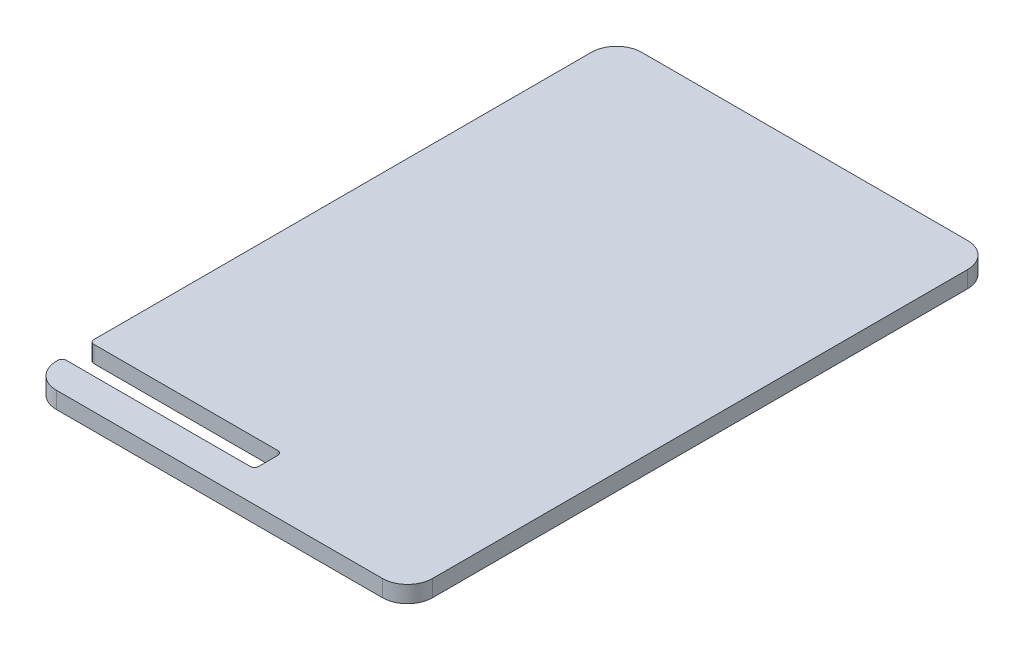
ISO-10303-21;
HEADER;
FILE_DESCRIPTION(('STEP AP214'),'2;1');
FILE_NAME('part.step','',(''),(''),'','','');
FILE_SCHEMA(('AUTOMOTIVE_DESIGN { 1 0 10303 214 1 1 1 1 }'));
ENDSEC;
DATA;
#1=APPLICATION_CONTEXT('core data for automotive mechanical design processes');
#2=APPLICATION_PROTOCOL_DEFINITION('international standard','automotive_design',2000,#1);
#3=PRODUCT_CONTEXT('',#1,'mechanical');
#4=PRODUCT('Part','Part','',(#3));
#5=PRODUCT_RELATED_PRODUCT_CATEGORY('part','',(#4));
#6=PRODUCT_DEFINITION_FORMATION('','',#4);
#7=PRODUCT_DEFINITION_CONTEXT('part definition',#1,'design');
#8=PRODUCT_DEFINITION('design','',#6,#7);
#9=PRODUCT_DEFINITION_SHAPE('','',#8);
#10=(LENGTH_UNIT() NAMED_UNIT(*) SI_UNIT(.MILLI.,.METRE.));
#11=(NAMED_UNIT(*) PLANE_ANGLE_UNIT() SI_UNIT($,.RADIAN.));
#12=(NAMED_UNIT(*) SI_UNIT($,.STERADIAN.) SOLID_ANGLE_UNIT());
#13=UNCERTAINTY_MEASURE_WITH_UNIT(LENGTH_MEASURE(1.E-05),#10,'distance_accuracy_value','');
#14=(GEOMETRIC_REPRESENTATION_CONTEXT(3) GLOBAL_UNCERTAINTY_ASSIGNED_CONTEXT((#13)) GLOBAL_UNIT_ASSIGNED_CONTEXT((#10,
#11,#12)) REPRESENTATION_CONTEXT('',''));
#15=CARTESIAN_POINT('',(0.,0.,0.));
#16=DIRECTION('',(0.,0.,1.));
#17=DIRECTION('',(1.,0.,0.));
#18=AXIS2_PLACEMENT_3D('',#15,#16,#17);
#19=CARTESIAN_POINT('',(-22.5,2.,-35.3062315740794));
#20=DIRECTION('',(1.,0.,0.));
#21=DIRECTION('',(0.,0.,-1.));
#22=AXIS2_PLACEMENT_3D('',#19,#20,#21);
#23=PLANE('',#22);
#24=DIRECTION('',(0.,0.,1.));
#25=VECTOR('',#24,1.);
#26=CARTESIAN_POINT('',(-22.5,0.,-35.3062315740794));
#27=LINE('',#26,#25);
#28=CARTESIAN_POINT('',(-22.5,0.,-32.3062315740794));
#29=VERTEX_POINT('',#28);
#30=CARTESIAN_POINT('',(-22.5,0.,27.2));
#31=VERTEX_POINT('',#30);
#32=EDGE_CURVE('E176',#29,#31,#27,.T.);
#33=ORIENTED_EDGE('',*,*,#32,.T.);
#34=DIRECTION('',(0.,1.,0.));
#35=VECTOR('',#34,1.);
#36=CARTESIAN_POINT('',(-22.5,2.,27.2));
#37=LINE('',#36,#35);
#38=CARTESIAN_POINT('',(-22.5,2.,27.2));
#39=VERTEX_POINT('',#38);
#40=EDGE_CURVE('E240',#31,#39,#37,.T.);
#41=ORIENTED_EDGE('',*,*,#40,.T.);
#42=DIRECTION('',(0.,0.,1.));
#43=VECTOR('',#42,1.);
#44=CARTESIAN_POINT('',(-22.5,2.,-35.3062315740794));
#45=LINE('',#44,#43);
#46=CARTESIAN_POINT('',(-22.5,2.,-32.3062315740794));
#47=VERTEX_POINT('',#46);
#48=EDGE_CURVE('E279',#47,#39,#45,.T.);
#49=ORIENTED_EDGE('',*,*,#48,.F.);
#50=DIRECTION('',(0.,-1.,0.));
#51=VECTOR('',#50,1.);
#52=CARTESIAN_POINT('',(-22.5,2.,-32.3062315740794));
#53=LINE('',#52,#51);
#54=EDGE_CURVE('E208',#47,#29,#53,.T.);
#55=ORIENTED_EDGE('',*,*,#54,.T.);
#56=EDGE_LOOP('',(#33,#41,#49,#55));
#57=FACE_BOUND('',#56,.T.);
#58=ADVANCED_FACE('F37',(#57),#23,.F.);
#59=CARTESIAN_POINT('',(-22.5,2.,31.5));
#60=VERTEX_POINT('',#59);
#61=CARTESIAN_POINT('',(-22.5,2.,31.6937684259206));
#62=VERTEX_POINT('',#61);
#63=EDGE_CURVE('E187',#60,#62,#45,.T.);
#64=ORIENTED_EDGE('',*,*,#63,.F.);
#65=DIRECTION('',(0.,1.,0.));
#66=VECTOR('',#65,1.);
#67=CARTESIAN_POINT('',(-22.5,2.,31.5));
#68=LINE('',#67,#66);
#69=CARTESIAN_POINT('',(-22.5,0.,31.5));
#70=VERTEX_POINT('',#69);
#71=EDGE_CURVE('E225',#60,#70,#68,.F.);
#72=ORIENTED_EDGE('',*,*,#71,.T.);
#73=CARTESIAN_POINT('',(-22.5,0.,31.6937684259206));
#74=VERTEX_POINT('',#73);
#75=EDGE_CURVE('E181',#70,#74,#27,.T.);
#76=ORIENTED_EDGE('',*,*,#75,.T.);
#77=DIRECTION('',(0.,-1.,0.));
#78=VECTOR('',#77,1.);
#79=CARTESIAN_POINT('',(-22.5,2.,31.6937684259206));
#80=LINE('',#79,#78);
#81=EDGE_CURVE('E157',#74,#62,#80,.F.);
#82=ORIENTED_EDGE('',*,*,#81,.T.);
#83=EDGE_LOOP('',(#64,#72,#76,#82));
#84=FACE_BOUND('',#83,.T.);
#85=ADVANCED_FACE('F313',(#84),#23,.F.);
#86=CARTESIAN_POINT('',(-22.5,2.,34.6937684259206));
#87=DIRECTION('',(0.,0.,-1.));
#88=DIRECTION('',(-1.,0.,0.));
#89=AXIS2_PLACEMENT_3D('',#86,#87,#88);
#90=PLANE('',#89);
#91=DIRECTION('',(1.,0.,0.));
#92=VECTOR('',#91,1.);
#93=CARTESIAN_POINT('',(-22.5,2.,34.6937684259206));
#94=LINE('',#93,#92);
#95=CARTESIAN_POINT('',(-19.5,2.,34.6937684259206));
#96=VERTEX_POINT('',#95);
#97=CARTESIAN_POINT('',(19.5,2.,34.6937684259206));
#98=VERTEX_POINT('',#97);
#99=EDGE_CURVE('E169',#96,#98,#94,.T.);
#100=ORIENTED_EDGE('',*,*,#99,.F.);
#101=DIRECTION('',(0.,-1.,0.));
#102=VECTOR('',#101,1.);
#103=CARTESIAN_POINT('',(-19.5,2.,34.6937684259206));
#104=LINE('',#103,#102);
#105=CARTESIAN_POINT('',(-19.5,0.,34.6937684259206));
#106=VERTEX_POINT('',#105);
#107=EDGE_CURVE('E155',#96,#106,#104,.T.);
#108=ORIENTED_EDGE('',*,*,#107,.T.);
#109=DIRECTION('',(1.,0.,0.));
#110=VECTOR('',#109,1.);
#111=CARTESIAN_POINT('',(-22.5,0.,34.6937684259206));
#112=LINE('',#111,#110);
#113=CARTESIAN_POINT('',(19.5,0.,34.6937684259206));
#114=VERTEX_POINT('',#113);
#115=EDGE_CURVE('E166',#106,#114,#112,.T.);
#116=ORIENTED_EDGE('',*,*,#115,.T.);
#117=DIRECTION('',(0.,-1.,0.));
#118=VECTOR('',#117,1.);
#119=CARTESIAN_POINT('',(19.5,2.,34.6937684259206));
#120=LINE('',#119,#118);
#121=EDGE_CURVE('E171',#114,#98,#120,.F.);
#122=ORIENTED_EDGE('',*,*,#121,.T.);
#123=EDGE_LOOP('',(#100,#108,#116,#122));
#124=FACE_BOUND('',#123,.T.);
#125=ADVANCED_FACE('F165',(#124),#90,.F.);
#126=CARTESIAN_POINT('',(22.5,2.,-35.3062315740794));
#127=DIRECTION('',(-1.,0.,0.));
#128=DIRECTION('',(0.,0.,1.));
#129=AXIS2_PLACEMENT_3D('',#126,#127,#128);
#130=PLANE('',#129);
#131=DIRECTION('',(0.,0.,-1.));
#132=VECTOR('',#131,1.);
#133=CARTESIAN_POINT('',(22.5,2.,-35.3062315740794));
#134=LINE('',#133,#132);
#135=CARTESIAN_POINT('',(22.5,2.,31.6937684259206));
#136=VERTEX_POINT('',#135);
#137=CARTESIAN_POINT('',(22.5,2.,-32.3062315740794));
#138=VERTEX_POINT('',#137);
#139=EDGE_CURVE('E283',#136,#138,#134,.T.);
#140=ORIENTED_EDGE('',*,*,#139,.F.);
#141=DIRECTION('',(0.,-1.,0.));
#142=VECTOR('',#141,1.);
#143=CARTESIAN_POINT('',(22.5,2.,31.6937684259206));
#144=LINE('',#143,#142);
#145=CARTESIAN_POINT('',(22.5,0.,31.6937684259206));
#146=VERTEX_POINT('',#145);
#147=EDGE_CURVE('E205',#136,#146,#144,.T.);
#148=ORIENTED_EDGE('',*,*,#147,.T.);
#149=DIRECTION('',(0.,0.,-1.));
#150=VECTOR('',#149,1.);
#151=CARTESIAN_POINT('',(22.5,0.,-35.3062315740794));
#152=LINE('',#151,#150);
#153=CARTESIAN_POINT('',(22.5,0.,-32.3062315740794));
#154=VERTEX_POINT('',#153);
#155=EDGE_CURVE('E175',#146,#154,#152,.T.);
#156=ORIENTED_EDGE('',*,*,#155,.T.);
#157=DIRECTION('',(0.,-1.,0.));
#158=VECTOR('',#157,1.);
#159=CARTESIAN_POINT('',(22.5,2.,-32.3062315740794));
#160=LINE('',#159,#158);
#161=EDGE_CURVE('E203',#154,#138,#160,.F.);
#162=ORIENTED_EDGE('',*,*,#161,.T.);
#163=EDGE_LOOP('',(#140,#148,#156,#162));
#164=FACE_BOUND('',#163,.T.);
#165=ADVANCED_FACE('F305',(#164),#130,.F.);
#166=CARTESIAN_POINT('',(-22.5,2.,-35.3062315740794));
#167=DIRECTION('',(0.,0.,1.));
#168=DIRECTION('',(1.,0.,0.));
#169=AXIS2_PLACEMENT_3D('',#166,#167,#168);
#170=PLANE('',#169);
#171=DIRECTION('',(-1.,0.,0.));
#172=VECTOR('',#171,1.);
#173=CARTESIAN_POINT('',(-22.5,0.,-35.3062315740794));
#174=LINE('',#173,#172);
#175=CARTESIAN_POINT('',(19.5,0.,-35.3062315740794));
#176=VERTEX_POINT('',#175);
#177=CARTESIAN_POINT('',(-19.5,0.,-35.3062315740794));
#178=VERTEX_POINT('',#177);
#179=EDGE_CURVE('E179',#176,#178,#174,.T.);
#180=ORIENTED_EDGE('',*,*,#179,.T.);
#181=DIRECTION('',(0.,-1.,0.));
#182=VECTOR('',#181,1.);
#183=CARTESIAN_POINT('',(-19.5,2.,-35.3062315740794));
#184=LINE('',#183,#182);
#185=CARTESIAN_POINT('',(-19.5,2.,-35.3062315740794));
#186=VERTEX_POINT('',#185);
#187=EDGE_CURVE('E214',#178,#186,#184,.F.);
#188=ORIENTED_EDGE('',*,*,#187,.T.);
#189=DIRECTION('',(-1.,0.,0.));
#190=VECTOR('',#189,1.);
#191=CARTESIAN_POINT('',(-22.5,2.,-35.3062315740794));
#192=LINE('',#191,#190);
#193=CARTESIAN_POINT('',(19.5,2.,-35.3062315740794));
#194=VERTEX_POINT('',#193);
#195=EDGE_CURVE('E188',#194,#186,#192,.T.);
#196=ORIENTED_EDGE('',*,*,#195,.F.);
#197=DIRECTION('',(0.,-1.,0.));
#198=VECTOR('',#197,1.);
#199=CARTESIAN_POINT('',(19.5,2.,-35.3062315740794));
#200=LINE('',#199,#198);
#201=EDGE_CURVE('E211',#194,#176,#200,.T.);
#202=ORIENTED_EDGE('',*,*,#201,.T.);
#203=EDGE_LOOP('',(#180,#188,#196,#202));
#204=FACE_BOUND('',#203,.T.);
#205=ADVANCED_FACE('F299',(#204),#170,.F.);
#206=CARTESIAN_POINT('',(0.,2.,0.));
#207=DIRECTION('',(0.,1.,0.));
#208=DIRECTION('',(0.,0.,1.));
#209=AXIS2_PLACEMENT_3D('',#206,#207,#208);
#210=PLANE('',#209);
#211=DIRECTION('',(1.,0.,0.));
#212=VECTOR('',#211,1.);
#213=CARTESIAN_POINT('',(-22.5,2.,31.));
#214=LINE('',#213,#212);
#215=CARTESIAN_POINT('',(-22.,2.,31.));
#216=VERTEX_POINT('',#215);
#217=CARTESIAN_POINT('',(0.,2.,31.));
#218=VERTEX_POINT('',#217);
#219=EDGE_CURVE('E262',#216,#218,#214,.T.);
#220=ORIENTED_EDGE('',*,*,#219,.F.);
#221=CARTESIAN_POINT('',(-22.,2.,31.5));
#222=DIRECTION('',(0.,1.,0.));
#223=DIRECTION('',(0.,0.,1.));
#224=AXIS2_PLACEMENT_3D('',#221,#222,#223);
#225=CIRCLE('',#224,0.5);
#226=EDGE_CURVE('E223',#216,#60,#225,.T.);
#227=ORIENTED_EDGE('',*,*,#226,.T.);
#228=ORIENTED_EDGE('',*,*,#63,.T.);
#229=CARTESIAN_POINT('',(-19.5,2.,31.6937684259206));
#230=DIRECTION('',(0.,1.,0.));
#231=DIRECTION('',(0.,0.,1.));
#232=AXIS2_PLACEMENT_3D('',#229,#230,#231);
#233=CIRCLE('',#232,3.);
#234=EDGE_CURVE('E201',#62,#96,#233,.T.);
#235=ORIENTED_EDGE('',*,*,#234,.T.);
#236=ORIENTED_EDGE('',*,*,#99,.T.);
#237=CARTESIAN_POINT('',(19.5,2.,31.6937684259206));
#238=DIRECTION('',(0.,1.,0.));
#239=DIRECTION('',(0.,0.,1.));
#240=AXIS2_PLACEMENT_3D('',#237,#238,#239);
#241=CIRCLE('',#240,3.);
#242=EDGE_CURVE('E199',#98,#136,#241,.T.);
#243=ORIENTED_EDGE('',*,*,#242,.T.);
#244=ORIENTED_EDGE('',*,*,#139,.T.);
#245=CARTESIAN_POINT('',(19.5,2.,-32.3062315740794));
#246=DIRECTION('',(0.,1.,0.));
#247=DIRECTION('',(0.,0.,1.));
#248=AXIS2_PLACEMENT_3D('',#245,#246,#247);
#249=CIRCLE('',#248,3.);
#250=EDGE_CURVE('E195',#138,#194,#249,.T.);
#251=ORIENTED_EDGE('',*,*,#250,.T.);
#252=ORIENTED_EDGE('',*,*,#195,.T.);
#253=CARTESIAN_POINT('',(-19.5,2.,-32.3062315740794));
#254=DIRECTION('',(0.,1.,0.));
#255=DIRECTION('',(0.,0.,1.));
#256=AXIS2_PLACEMENT_3D('',#253,#254,#255);
#257=CIRCLE('',#256,3.);
#258=EDGE_CURVE('E197',#186,#47,#257,.T.);
#259=ORIENTED_EDGE('',*,*,#258,.T.);
#260=ORIENTED_EDGE('',*,*,#48,.T.);
#261=CARTESIAN_POINT('',(-22.,2.,27.2));
#262=DIRECTION('',(0.,1.,0.));
#263=DIRECTION('',(0.,0.,1.));
#264=AXIS2_PLACEMENT_3D('',#261,#262,#263);
#265=CIRCLE('',#264,0.5);
#266=CARTESIAN_POINT('',(-22.,2.,27.7));
#267=VERTEX_POINT('',#266);
#268=EDGE_CURVE('E221',#39,#267,#265,.T.);
#269=ORIENTED_EDGE('',*,*,#268,.T.);
#270=DIRECTION('',(-1.,0.,0.));
#271=VECTOR('',#270,1.);
#272=CARTESIAN_POINT('',(-22.5,2.,27.7));
#273=LINE('',#272,#271);
#274=CARTESIAN_POINT('',(0.,2.,27.7));
#275=VERTEX_POINT('',#274);
#276=EDGE_CURVE('E254',#275,#267,#273,.T.);
#277=ORIENTED_EDGE('',*,*,#276,.F.);
#278=CARTESIAN_POINT('',(0.,2.,28.2));
#279=DIRECTION('',(0.,1.,0.));
#280=DIRECTION('',(0.,0.,1.));
#281=AXIS2_PLACEMENT_3D('',#278,#279,#280);
#282=CIRCLE('',#281,0.5);
#283=CARTESIAN_POINT('',(0.499999999999997,2.,28.2));
#284=VERTEX_POINT('',#283);
#285=EDGE_CURVE('E45',#275,#284,#282,.F.);
#286=ORIENTED_EDGE('',*,*,#285,.T.);
#287=DIRECTION('',(0.,0.,-1.));
#288=VECTOR('',#287,1.);
#289=CARTESIAN_POINT('',(0.499999999999997,2.,27.7));
#290=LINE('',#289,#288);
#291=CARTESIAN_POINT('',(0.499999999999997,2.,30.5));
#292=VERTEX_POINT('',#291);
#293=EDGE_CURVE('E252',#292,#284,#290,.T.);
#294=ORIENTED_EDGE('',*,*,#293,.F.);
#295=CARTESIAN_POINT('',(0.,2.,30.5));
#296=DIRECTION('',(0.,1.,0.));
#297=DIRECTION('',(0.,0.,1.));
#298=AXIS2_PLACEMENT_3D('',#295,#296,#297);
#299=CIRCLE('',#298,0.5);
#300=EDGE_CURVE('E243',#292,#218,#299,.F.);
#301=ORIENTED_EDGE('',*,*,#300,.T.);
#302=EDGE_LOOP('',(#220,#227,#228,#235,#236,#243,#244,#251,#252,#259,#260,#269,#277,#286,#294,#301));
#303=FACE_BOUND('',#302,.T.);
#304=ADVANCED_FACE('F251',(#303),#210,.T.);
#305=CARTESIAN_POINT('',(0.,0.,0.));
#306=DIRECTION('',(0.,1.,0.));
#307=DIRECTION('',(0.,0.,1.));
#308=AXIS2_PLACEMENT_3D('',#305,#306,#307);
#309=PLANE('',#308);
#310=ORIENTED_EDGE('',*,*,#75,.F.);
#311=CARTESIAN_POINT('',(-22.,0.,31.5));
#312=DIRECTION('',(0.,1.,0.));
#313=DIRECTION('',(0.,0.,1.));
#314=AXIS2_PLACEMENT_3D('',#311,#312,#313);
#315=CIRCLE('',#314,0.5);
#316=CARTESIAN_POINT('',(-22.,0.,31.));
#317=VERTEX_POINT('',#316);
#318=EDGE_CURVE('E228',#70,#317,#315,.F.);
#319=ORIENTED_EDGE('',*,*,#318,.T.);
#320=DIRECTION('',(-1.,0.,0.));
#321=VECTOR('',#320,1.);
#322=CARTESIAN_POINT('',(-22.5,0.,31.));
#323=LINE('',#322,#321);
#324=CARTESIAN_POINT('',(0.,0.,31.));
#325=VERTEX_POINT('',#324);
#326=EDGE_CURVE('E269',#325,#317,#323,.T.);
#327=ORIENTED_EDGE('',*,*,#326,.F.);
#328=CARTESIAN_POINT('',(0.,0.,30.5));
#329=DIRECTION('',(0.,1.,0.));
#330=DIRECTION('',(0.,0.,1.));
#331=AXIS2_PLACEMENT_3D('',#328,#329,#330);
#332=CIRCLE('',#331,0.5);
#333=CARTESIAN_POINT('',(0.499999999999997,0.,30.5));
#334=VERTEX_POINT('',#333);
#335=EDGE_CURVE('E245',#325,#334,#332,.T.);
#336=ORIENTED_EDGE('',*,*,#335,.T.);
#337=DIRECTION('',(0.,0.,1.));
#338=VECTOR('',#337,1.);
#339=CARTESIAN_POINT('',(0.499999999999997,0.,27.7));
#340=LINE('',#339,#338);
#341=CARTESIAN_POINT('',(0.499999999999997,0.,28.2));
#342=VERTEX_POINT('',#341);
#343=EDGE_CURVE('E270',#342,#334,#340,.T.);
#344=ORIENTED_EDGE('',*,*,#343,.F.);
#345=CARTESIAN_POINT('',(0.,0.,28.2));
#346=DIRECTION('',(0.,1.,0.));
#347=DIRECTION('',(0.,0.,1.));
#348=AXIS2_PLACEMENT_3D('',#345,#346,#347);
#349=CIRCLE('',#348,0.5);
#350=CARTESIAN_POINT('',(0.,0.,27.7));
#351=VERTEX_POINT('',#350);
#352=EDGE_CURVE('E11',#342,#351,#349,.T.);
#353=ORIENTED_EDGE('',*,*,#352,.T.);
#354=DIRECTION('',(1.,0.,0.));
#355=VECTOR('',#354,1.);
#356=CARTESIAN_POINT('',(-22.5,0.,27.7));
#357=LINE('',#356,#355);
#358=CARTESIAN_POINT('',(-22.,0.,27.7));
#359=VERTEX_POINT('',#358);
#360=EDGE_CURVE('E268',#359,#351,#357,.T.);
#361=ORIENTED_EDGE('',*,*,#360,.F.);
#362=CARTESIAN_POINT('',(-22.,0.,27.2));
#363=DIRECTION('',(0.,1.,0.));
#364=DIRECTION('',(0.,0.,1.));
#365=AXIS2_PLACEMENT_3D('',#362,#363,#364);
#366=CIRCLE('',#365,0.5);
#367=EDGE_CURVE('E52',#359,#31,#366,.F.);
#368=ORIENTED_EDGE('',*,*,#367,.T.);
#369=ORIENTED_EDGE('',*,*,#32,.F.);
#370=CARTESIAN_POINT('',(-19.5,0.,-32.3062315740794));
#371=DIRECTION('',(0.,1.,0.));
#372=DIRECTION('',(0.,0.,1.));
#373=AXIS2_PLACEMENT_3D('',#370,#371,#372);
#374=CIRCLE('',#373,3.);
#375=EDGE_CURVE('E191',#29,#178,#374,.F.);
#376=ORIENTED_EDGE('',*,*,#375,.T.);
#377=ORIENTED_EDGE('',*,*,#179,.F.);
#378=CARTESIAN_POINT('',(19.5,0.,-32.3062315740794));
#379=DIRECTION('',(0.,1.,0.));
#380=DIRECTION('',(0.,0.,1.));
#381=AXIS2_PLACEMENT_3D('',#378,#379,#380);
#382=CIRCLE('',#381,3.);
#383=EDGE_CURVE('E170',#176,#154,#382,.F.);
#384=ORIENTED_EDGE('',*,*,#383,.T.);
#385=ORIENTED_EDGE('',*,*,#155,.F.);
#386=CARTESIAN_POINT('',(19.5,0.,31.6937684259206));
#387=DIRECTION('',(0.,1.,0.));
#388=DIRECTION('',(0.,0.,1.));
#389=AXIS2_PLACEMENT_3D('',#386,#387,#388);
#390=CIRCLE('',#389,3.);
#391=EDGE_CURVE('E160',#146,#114,#390,.F.);
#392=ORIENTED_EDGE('',*,*,#391,.T.);
#393=ORIENTED_EDGE('',*,*,#115,.F.);
#394=CARTESIAN_POINT('',(-19.5,0.,31.6937684259206));
#395=DIRECTION('',(0.,1.,0.));
#396=DIRECTION('',(0.,0.,1.));
#397=AXIS2_PLACEMENT_3D('',#394,#395,#396);
#398=CIRCLE('',#397,3.);
#399=EDGE_CURVE('E151',#106,#74,#398,.F.);
#400=ORIENTED_EDGE('',*,*,#399,.T.);
#401=EDGE_LOOP('',(#310,#319,#327,#336,#344,#353,#361,#368,#369,#376,#377,#384,#385,#392,#393,#400));
#402=FACE_BOUND('',#401,.T.);
#403=ADVANCED_FACE('F173',(#402),#309,.F.);
#404=CARTESIAN_POINT('',(-22.5,-23.2355331335435,27.7));
#405=DIRECTION('',(0.,0.,-1.));
#406=DIRECTION('',(-1.,0.,0.));
#407=AXIS2_PLACEMENT_3D('',#404,#405,#406);
#408=PLANE('',#407);
#409=ORIENTED_EDGE('',*,*,#360,.T.);
#410=DIRECTION('',(0.,1.,0.));
#411=VECTOR('',#410,1.);
#412=CARTESIAN_POINT('',(0.,2.,27.7));
#413=LINE('',#412,#411);
#414=EDGE_CURVE('E237',#351,#275,#413,.T.);
#415=ORIENTED_EDGE('',*,*,#414,.T.);
#416=ORIENTED_EDGE('',*,*,#276,.T.);
#417=DIRECTION('',(0.,1.,0.));
#418=VECTOR('',#417,1.);
#419=CARTESIAN_POINT('',(-22.,-23.2355331335435,27.7));
#420=LINE('',#419,#418);
#421=EDGE_CURVE('E235',#267,#359,#420,.F.);
#422=ORIENTED_EDGE('',*,*,#421,.T.);
#423=EDGE_LOOP('',(#409,#415,#416,#422));
#424=FACE_BOUND('',#423,.T.);
#425=ADVANCED_FACE('F266',(#424),#408,.F.);
#426=CARTESIAN_POINT('',(0.499999999999997,-23.2355331335435,27.7));
#427=DIRECTION('',(1.,0.,0.));
#428=DIRECTION('',(0.,0.,-1.));
#429=AXIS2_PLACEMENT_3D('',#426,#427,#428);
#430=PLANE('',#429);
#431=ORIENTED_EDGE('',*,*,#343,.T.);
#432=DIRECTION('',(0.,1.,0.));
#433=VECTOR('',#432,1.);
#434=CARTESIAN_POINT('',(0.499999999999997,2.,30.5));
#435=LINE('',#434,#433);
#436=EDGE_CURVE('E232',#334,#292,#435,.T.);
#437=ORIENTED_EDGE('',*,*,#436,.T.);
#438=ORIENTED_EDGE('',*,*,#293,.T.);
#439=DIRECTION('',(0.,1.,0.));
#440=VECTOR('',#439,1.);
#441=CARTESIAN_POINT('',(0.499999999999997,0.,28.2));
#442=LINE('',#441,#440);
#443=EDGE_CURVE('E230',#284,#342,#442,.F.);
#444=ORIENTED_EDGE('',*,*,#443,.T.);
#445=EDGE_LOOP('',(#431,#437,#438,#444));
#446=FACE_BOUND('',#445,.T.);
#447=ADVANCED_FACE('F260',(#446),#430,.F.);
#448=CARTESIAN_POINT('',(-22.5,-23.2355331335435,31.));
#449=DIRECTION('',(0.,0.,1.));
#450=DIRECTION('',(1.,0.,0.));
#451=AXIS2_PLACEMENT_3D('',#448,#449,#450);
#452=PLANE('',#451);
#453=ORIENTED_EDGE('',*,*,#326,.T.);
#454=DIRECTION('',(0.,1.,0.));
#455=VECTOR('',#454,1.);
#456=CARTESIAN_POINT('',(-22.,-23.2355331335435,31.));
#457=LINE('',#456,#455);
#458=EDGE_CURVE('E218',#317,#216,#457,.T.);
#459=ORIENTED_EDGE('',*,*,#458,.T.);
#460=ORIENTED_EDGE('',*,*,#219,.T.);
#461=DIRECTION('',(0.,1.,0.));
#462=VECTOR('',#461,1.);
#463=CARTESIAN_POINT('',(0.,0.,31.));
#464=LINE('',#463,#462);
#465=EDGE_CURVE('E216',#218,#325,#464,.F.);
#466=ORIENTED_EDGE('',*,*,#465,.T.);
#467=EDGE_LOOP('',(#453,#459,#460,#466));
#468=FACE_BOUND('',#467,.T.);
#469=ADVANCED_FACE('F320',(#468),#452,.F.);
#470=CARTESIAN_POINT('',(-19.5,2.,31.6937684259206));
#471=DIRECTION('',(0.,-1.,0.));
#472=DIRECTION('',(0.,0.,-1.));
#473=AXIS2_PLACEMENT_3D('',#470,#471,#472);
#474=CYLINDRICAL_SURFACE('',#473,3.);
#475=ORIENTED_EDGE('',*,*,#234,.F.);
#476=ORIENTED_EDGE('',*,*,#81,.F.);
#477=ORIENTED_EDGE('',*,*,#399,.F.);
#478=ORIENTED_EDGE('',*,*,#107,.F.);
#479=EDGE_LOOP('',(#475,#476,#477,#478));
#480=FACE_BOUND('',#479,.T.);
#481=ADVANCED_FACE('F154',(#480),#474,.T.);
#482=CARTESIAN_POINT('',(19.5,2.,31.6937684259206));
#483=DIRECTION('',(0.,-1.,0.));
#484=DIRECTION('',(0.,0.,-1.));
#485=AXIS2_PLACEMENT_3D('',#482,#483,#484);
#486=CYLINDRICAL_SURFACE('',#485,3.);
#487=ORIENTED_EDGE('',*,*,#242,.F.);
#488=ORIENTED_EDGE('',*,*,#121,.F.);
#489=ORIENTED_EDGE('',*,*,#391,.F.);
#490=ORIENTED_EDGE('',*,*,#147,.F.);
#491=EDGE_LOOP('',(#487,#488,#489,#490));
#492=FACE_BOUND('',#491,.T.);
#493=ADVANCED_FACE('F309',(#492),#486,.T.);
#494=CARTESIAN_POINT('',(-19.5,2.,-32.3062315740794));
#495=DIRECTION('',(0.,-1.,0.));
#496=DIRECTION('',(0.,0.,-1.));
#497=AXIS2_PLACEMENT_3D('',#494,#495,#496);
#498=CYLINDRICAL_SURFACE('',#497,3.);
#499=ORIENTED_EDGE('',*,*,#258,.F.);
#500=ORIENTED_EDGE('',*,*,#187,.F.);
#501=ORIENTED_EDGE('',*,*,#375,.F.);
#502=ORIENTED_EDGE('',*,*,#54,.F.);
#503=EDGE_LOOP('',(#499,#500,#501,#502));
#504=FACE_BOUND('',#503,.T.);
#505=ADVANCED_FACE('F295',(#504),#498,.T.);
#506=CARTESIAN_POINT('',(19.5,2.,-32.3062315740794));
#507=DIRECTION('',(0.,-1.,0.));
#508=DIRECTION('',(0.,0.,-1.));
#509=AXIS2_PLACEMENT_3D('',#506,#507,#508);
#510=CYLINDRICAL_SURFACE('',#509,3.);
#511=ORIENTED_EDGE('',*,*,#250,.F.);
#512=ORIENTED_EDGE('',*,*,#161,.F.);
#513=ORIENTED_EDGE('',*,*,#383,.F.);
#514=ORIENTED_EDGE('',*,*,#201,.F.);
#515=EDGE_LOOP('',(#511,#512,#513,#514));
#516=FACE_BOUND('',#515,.T.);
#517=ADVANCED_FACE('F301',(#516),#510,.T.);
#518=CARTESIAN_POINT('',(-22.,-23.2355331335435,31.5));
#519=DIRECTION('',(0.,1.,0.));
#520=DIRECTION('',(0.,0.,1.));
#521=AXIS2_PLACEMENT_3D('',#518,#519,#520);
#522=CYLINDRICAL_SURFACE('',#521,0.5);
#523=ORIENTED_EDGE('',*,*,#318,.F.);
#524=ORIENTED_EDGE('',*,*,#71,.F.);
#525=ORIENTED_EDGE('',*,*,#226,.F.);
#526=ORIENTED_EDGE('',*,*,#458,.F.);
#527=EDGE_LOOP('',(#523,#524,#525,#526));
#528=FACE_BOUND('',#527,.T.);
#529=ADVANCED_FACE('F318',(#528),#522,.T.);
#530=CARTESIAN_POINT('',(0.,-23.2355331335435,30.5));
#531=DIRECTION('',(0.,-1.,0.));
#532=DIRECTION('',(0.,0.,-1.));
#533=AXIS2_PLACEMENT_3D('',#530,#531,#532);
#534=CYLINDRICAL_SURFACE('',#533,0.5);
#535=ORIENTED_EDGE('',*,*,#335,.F.);
#536=ORIENTED_EDGE('',*,*,#465,.F.);
#537=ORIENTED_EDGE('',*,*,#300,.F.);
#538=ORIENTED_EDGE('',*,*,#436,.F.);
#539=EDGE_LOOP('',(#535,#536,#537,#538));
#540=FACE_BOUND('',#539,.T.);
#541=ADVANCED_FACE('F324',(#540),#534,.F.);
#542=CARTESIAN_POINT('',(0.,-23.2355331335435,28.2));
#543=DIRECTION('',(0.,-1.,0.));
#544=DIRECTION('',(0.,0.,-1.));
#545=AXIS2_PLACEMENT_3D('',#542,#543,#544);
#546=CYLINDRICAL_SURFACE('',#545,0.5);
#547=ORIENTED_EDGE('',*,*,#352,.F.);
#548=ORIENTED_EDGE('',*,*,#443,.F.);
#549=ORIENTED_EDGE('',*,*,#285,.F.);
#550=ORIENTED_EDGE('',*,*,#414,.F.);
#551=EDGE_LOOP('',(#547,#548,#549,#550));
#552=FACE_BOUND('',#551,.T.);
#553=ADVANCED_FACE('F264',(#552),#546,.F.);
#554=CARTESIAN_POINT('',(-22.,2.,27.2));
#555=DIRECTION('',(0.,1.,0.));
#556=DIRECTION('',(0.,0.,1.));
#557=AXIS2_PLACEMENT_3D('',#554,#555,#556);
#558=CYLINDRICAL_SURFACE('',#557,0.5);
#559=ORIENTED_EDGE('',*,*,#367,.F.);
#560=ORIENTED_EDGE('',*,*,#421,.F.);
#561=ORIENTED_EDGE('',*,*,#268,.F.);
#562=ORIENTED_EDGE('',*,*,#40,.F.);
#563=EDGE_LOOP('',(#559,#560,#561,#562));
#564=FACE_BOUND('',#563,.T.);
#565=ADVANCED_FACE('F39',(#564),#558,.T.);
#566=CLOSED_SHELL('',(#58,#85,#125,#165,#205,#304,#403,#425,#447,#469,#481,#493,#505,#517,#529,
#541,#553,#565));
#567=MANIFOLD_SOLID_BREP('B2',#566);
#568=ADVANCED_BREP_SHAPE_REPRESENTATION('',(#18,#567),#14);
#569=SHAPE_DEFINITION_REPRESENTATION(#9,#568);
ENDSEC;
END-ISO-10303-21;
